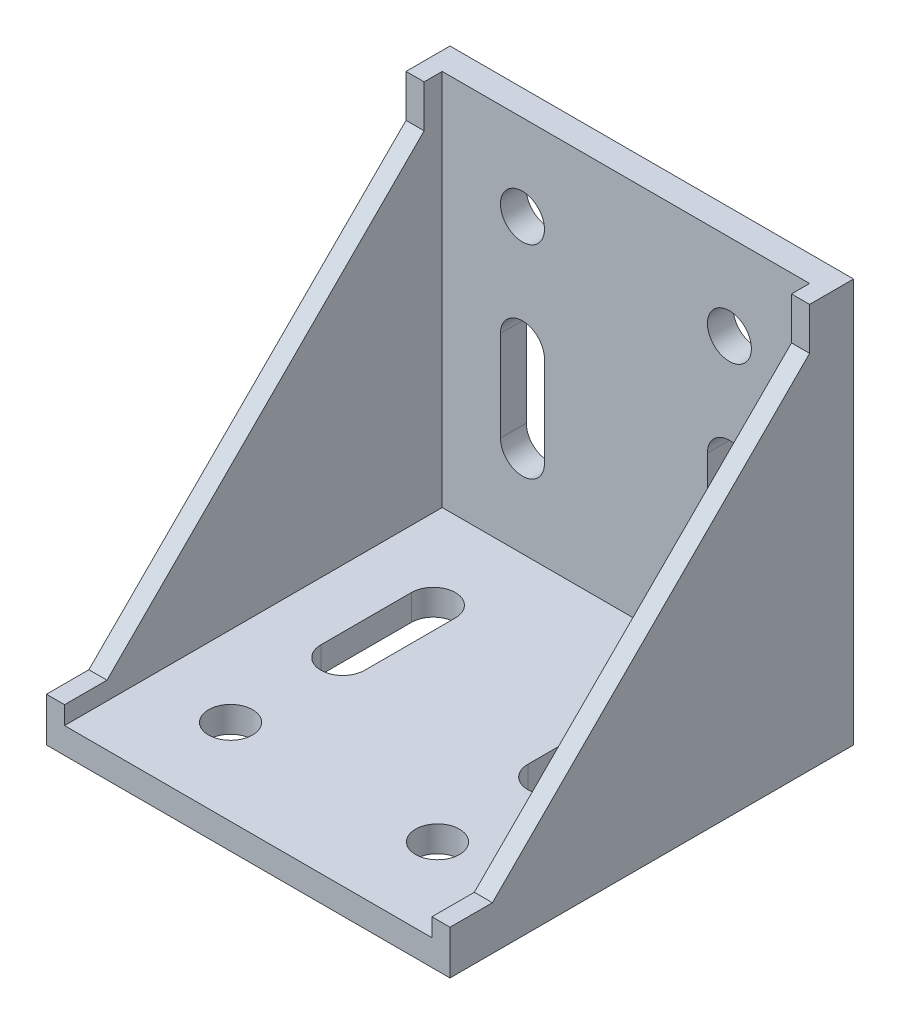
ISO-10303-21;
HEADER;
FILE_DESCRIPTION(('STEP AP214'),'2;1');
FILE_NAME('part.step','',(''),(''),'','','');
FILE_SCHEMA(('AUTOMOTIVE_DESIGN { 1 0 10303 214 1 1 1 1 }'));
ENDSEC;
DATA;
#1=APPLICATION_CONTEXT('core data for automotive mechanical design processes');
#2=APPLICATION_PROTOCOL_DEFINITION('international standard','automotive_design',2000,#1);
#3=PRODUCT_CONTEXT('',#1,'mechanical');
#4=PRODUCT('Part','Part','',(#3));
#5=PRODUCT_RELATED_PRODUCT_CATEGORY('part','',(#4));
#6=PRODUCT_DEFINITION_FORMATION('','',#4);
#7=PRODUCT_DEFINITION_CONTEXT('part definition',#1,'design');
#8=PRODUCT_DEFINITION('design','',#6,#7);
#9=PRODUCT_DEFINITION_SHAPE('','',#8);
#10=(LENGTH_UNIT() NAMED_UNIT(*) SI_UNIT(.MILLI.,.METRE.));
#11=(NAMED_UNIT(*) PLANE_ANGLE_UNIT() SI_UNIT($,.RADIAN.));
#12=(NAMED_UNIT(*) SI_UNIT($,.STERADIAN.) SOLID_ANGLE_UNIT());
#13=UNCERTAINTY_MEASURE_WITH_UNIT(LENGTH_MEASURE(1.E-05),#10,'distance_accuracy_value','');
#14=(GEOMETRIC_REPRESENTATION_CONTEXT(3) GLOBAL_UNCERTAINTY_ASSIGNED_CONTEXT((#13)) GLOBAL_UNIT_ASSIGNED_CONTEXT((#10,
#11,#12)) REPRESENTATION_CONTEXT('',''));
#15=CARTESIAN_POINT('',(0.,0.,0.));
#16=DIRECTION('',(0.,0.,1.));
#17=DIRECTION('',(1.,0.,0.));
#18=AXIS2_PLACEMENT_3D('',#15,#16,#17);
#19=CARTESIAN_POINT('',(-39.,0.,5.));
#20=DIRECTION('',(0.,0.,1.));
#21=DIRECTION('',(1.,0.,0.));
#22=AXIS2_PLACEMENT_3D('',#19,#20,#21);
#23=PLANE('',#22);
#24=DIRECTION('',(-1.,0.,0.));
#25=VECTOR('',#24,1.);
#26=CARTESIAN_POINT('',(-39.,4.99999999999999,5.));
#27=LINE('',#26,#25);
#28=CARTESIAN_POINT('',(35.5,5.,5.));
#29=VERTEX_POINT('',#28);
#30=CARTESIAN_POINT('',(-35.5,4.99999999999999,5.));
#31=VERTEX_POINT('',#30);
#32=EDGE_CURVE('E314',#29,#31,#27,.T.);
#33=ORIENTED_EDGE('',*,*,#32,.F.);
#34=DIRECTION('',(0.,-1.,0.));
#35=VECTOR('',#34,1.);
#36=CARTESIAN_POINT('',(35.5,0.,5.));
#37=LINE('',#36,#35);
#38=CARTESIAN_POINT('',(35.5,78.,5.));
#39=VERTEX_POINT('',#38);
#40=EDGE_CURVE('E319',#39,#29,#37,.T.);
#41=ORIENTED_EDGE('',*,*,#40,.F.);
#42=DIRECTION('',(-1.,0.,0.));
#43=VECTOR('',#42,1.);
#44=CARTESIAN_POINT('',(-39.,78.,5.));
#45=LINE('',#44,#43);
#46=CARTESIAN_POINT('',(-35.5,78.,5.));
#47=VERTEX_POINT('',#46);
#48=EDGE_CURVE('E369',#39,#47,#45,.T.);
#49=ORIENTED_EDGE('',*,*,#48,.T.);
#50=DIRECTION('',(0.,-1.,0.));
#51=VECTOR('',#50,1.);
#52=CARTESIAN_POINT('',(-35.5,0.,5.));
#53=LINE('',#52,#51);
#54=EDGE_CURVE('E358',#47,#31,#53,.T.);
#55=ORIENTED_EDGE('',*,*,#54,.T.);
#56=EDGE_LOOP('',(#33,#41,#49,#55));
#57=FACE_BOUND('',#56,.T.);
#58=CARTESIAN_POINT('',(20.,61.45,5.));
#59=DIRECTION('',(0.,0.,1.));
#60=DIRECTION('',(-1.,0.,0.));
#61=AXIS2_PLACEMENT_3D('',#58,#59,#60);
#62=CIRCLE('',#61,4.25);
#63=CARTESIAN_POINT('',(15.75,61.45,5.));
#64=VERTEX_POINT('',#63);
#65=EDGE_CURVE('E441',#64,#64,#62,.T.);
#66=ORIENTED_EDGE('',*,*,#65,.F.);
#67=EDGE_LOOP('',(#66));
#68=FACE_BOUND('',#67,.T.);
#69=CARTESIAN_POINT('',(-20.,61.45,5.));
#70=DIRECTION('',(0.,0.,1.));
#71=DIRECTION('',(1.,0.,0.));
#72=AXIS2_PLACEMENT_3D('',#69,#70,#71);
#73=CIRCLE('',#72,4.25);
#74=CARTESIAN_POINT('',(-15.75,61.45,5.));
#75=VERTEX_POINT('',#74);
#76=EDGE_CURVE('E480',#75,#75,#73,.T.);
#77=ORIENTED_EDGE('',*,*,#76,.F.);
#78=EDGE_LOOP('',(#77));
#79=FACE_BOUND('',#78,.T.);
#80=DIRECTION('',(0.,-1.,0.));
#81=VECTOR('',#80,1.);
#82=CARTESIAN_POINT('',(-24.25,39.75,5.));
#83=LINE('',#82,#81);
#84=CARTESIAN_POINT('',(-24.25,39.75,5.));
#85=VERTEX_POINT('',#84);
#86=CARTESIAN_POINT('',(-24.25,22.25,5.));
#87=VERTEX_POINT('',#86);
#88=EDGE_CURVE('E488',#85,#87,#83,.T.);
#89=ORIENTED_EDGE('',*,*,#88,.F.);
#90=CARTESIAN_POINT('',(-20.,39.75,5.));
#91=DIRECTION('',(0.,0.,1.));
#92=DIRECTION('',(1.,0.,0.));
#93=AXIS2_PLACEMENT_3D('',#90,#91,#92);
#94=CIRCLE('',#93,4.25);
#95=CARTESIAN_POINT('',(-15.75,39.75,5.));
#96=VERTEX_POINT('',#95);
#97=EDGE_CURVE('E486',#96,#85,#94,.T.);
#98=ORIENTED_EDGE('',*,*,#97,.F.);
#99=DIRECTION('',(0.,1.,0.));
#100=VECTOR('',#99,1.);
#101=CARTESIAN_POINT('',(-15.75,39.75,5.));
#102=LINE('',#101,#100);
#103=CARTESIAN_POINT('',(-15.75,22.25,5.));
#104=VERTEX_POINT('',#103);
#105=EDGE_CURVE('E494',#104,#96,#102,.T.);
#106=ORIENTED_EDGE('',*,*,#105,.F.);
#107=CARTESIAN_POINT('',(-20.,22.25,5.));
#108=DIRECTION('',(0.,0.,1.));
#109=DIRECTION('',(1.,0.,0.));
#110=AXIS2_PLACEMENT_3D('',#107,#108,#109);
#111=CIRCLE('',#110,4.25);
#112=EDGE_CURVE('E491',#87,#104,#111,.T.);
#113=ORIENTED_EDGE('',*,*,#112,.F.);
#114=EDGE_LOOP('',(#89,#98,#106,#113));
#115=FACE_BOUND('',#114,.T.);
#116=DIRECTION('',(0.,-1.,0.));
#117=VECTOR('',#116,1.);
#118=CARTESIAN_POINT('',(15.75,39.75,5.));
#119=LINE('',#118,#117);
#120=CARTESIAN_POINT('',(15.75,39.75,5.));
#121=VERTEX_POINT('',#120);
#122=CARTESIAN_POINT('',(15.75,22.25,5.));
#123=VERTEX_POINT('',#122);
#124=EDGE_CURVE('E451',#121,#123,#119,.T.);
#125=ORIENTED_EDGE('',*,*,#124,.F.);
#126=CARTESIAN_POINT('',(20.,39.75,5.));
#127=DIRECTION('',(0.,0.,1.));
#128=DIRECTION('',(-1.,0.,0.));
#129=AXIS2_PLACEMENT_3D('',#126,#127,#128);
#130=CIRCLE('',#129,4.25);
#131=CARTESIAN_POINT('',(24.25,39.75,5.));
#132=VERTEX_POINT('',#131);
#133=EDGE_CURVE('E449',#132,#121,#130,.T.);
#134=ORIENTED_EDGE('',*,*,#133,.F.);
#135=DIRECTION('',(0.,1.,0.));
#136=VECTOR('',#135,1.);
#137=CARTESIAN_POINT('',(24.25,39.75,5.));
#138=LINE('',#137,#136);
#139=CARTESIAN_POINT('',(24.25,22.25,5.));
#140=VERTEX_POINT('',#139);
#141=EDGE_CURVE('E457',#140,#132,#138,.T.);
#142=ORIENTED_EDGE('',*,*,#141,.F.);
#143=CARTESIAN_POINT('',(20.,22.25,5.));
#144=DIRECTION('',(0.,0.,1.));
#145=DIRECTION('',(-1.,0.,0.));
#146=AXIS2_PLACEMENT_3D('',#143,#144,#145);
#147=CIRCLE('',#146,4.25);
#148=EDGE_CURVE('E454',#123,#140,#147,.T.);
#149=ORIENTED_EDGE('',*,*,#148,.F.);
#150=EDGE_LOOP('',(#125,#134,#142,#149));
#151=FACE_BOUND('',#150,.T.);
#152=ADVANCED_FACE('F30',(#57,#68,#79,#115,#151),#23,.T.);
#153=CARTESIAN_POINT('',(-39.,0.,0.));
#154=DIRECTION('',(0.,0.,1.));
#155=DIRECTION('',(1.,0.,0.));
#156=AXIS2_PLACEMENT_3D('',#153,#154,#155);
#157=PLANE('',#156);
#158=CARTESIAN_POINT('',(20.,39.75,0.));
#159=DIRECTION('',(0.,0.,1.));
#160=DIRECTION('',(-1.,0.,0.));
#161=AXIS2_PLACEMENT_3D('',#158,#159,#160);
#162=CIRCLE('',#161,4.25);
#163=CARTESIAN_POINT('',(24.25,39.75,0.));
#164=VERTEX_POINT('',#163);
#165=CARTESIAN_POINT('',(15.75,39.75,0.));
#166=VERTEX_POINT('',#165);
#167=EDGE_CURVE('E444',#164,#166,#162,.T.);
#168=ORIENTED_EDGE('',*,*,#167,.T.);
#169=DIRECTION('',(0.,-1.,0.));
#170=VECTOR('',#169,1.);
#171=CARTESIAN_POINT('',(15.75,39.75,0.));
#172=LINE('',#171,#170);
#173=CARTESIAN_POINT('',(15.75,22.25,0.));
#174=VERTEX_POINT('',#173);
#175=EDGE_CURVE('E462',#166,#174,#172,.T.);
#176=ORIENTED_EDGE('',*,*,#175,.T.);
#177=CARTESIAN_POINT('',(20.,22.25,0.));
#178=DIRECTION('',(0.,0.,1.));
#179=DIRECTION('',(-1.,0.,0.));
#180=AXIS2_PLACEMENT_3D('',#177,#178,#179);
#181=CIRCLE('',#180,4.25);
#182=CARTESIAN_POINT('',(24.25,22.25,0.));
#183=VERTEX_POINT('',#182);
#184=EDGE_CURVE('E465',#174,#183,#181,.T.);
#185=ORIENTED_EDGE('',*,*,#184,.T.);
#186=DIRECTION('',(0.,1.,0.));
#187=VECTOR('',#186,1.);
#188=CARTESIAN_POINT('',(24.25,39.75,0.));
#189=LINE('',#188,#187);
#190=EDGE_CURVE('E452',#183,#164,#189,.T.);
#191=ORIENTED_EDGE('',*,*,#190,.T.);
#192=EDGE_LOOP('',(#168,#176,#185,#191));
#193=FACE_BOUND('',#192,.T.);
#194=CARTESIAN_POINT('',(-20.,39.75,0.));
#195=DIRECTION('',(0.,0.,1.));
#196=DIRECTION('',(1.,0.,0.));
#197=AXIS2_PLACEMENT_3D('',#194,#195,#196);
#198=CIRCLE('',#197,4.25);
#199=CARTESIAN_POINT('',(-15.75,39.75,0.));
#200=VERTEX_POINT('',#199);
#201=CARTESIAN_POINT('',(-24.25,39.75,0.));
#202=VERTEX_POINT('',#201);
#203=EDGE_CURVE('E483',#200,#202,#198,.T.);
#204=ORIENTED_EDGE('',*,*,#203,.T.);
#205=DIRECTION('',(0.,-1.,0.));
#206=VECTOR('',#205,1.);
#207=CARTESIAN_POINT('',(-24.25,39.75,0.));
#208=LINE('',#207,#206);
#209=CARTESIAN_POINT('',(-24.25,22.25,0.));
#210=VERTEX_POINT('',#209);
#211=EDGE_CURVE('E499',#202,#210,#208,.T.);
#212=ORIENTED_EDGE('',*,*,#211,.T.);
#213=CARTESIAN_POINT('',(-20.,22.25,0.));
#214=DIRECTION('',(0.,0.,1.));
#215=DIRECTION('',(1.,0.,0.));
#216=AXIS2_PLACEMENT_3D('',#213,#214,#215);
#217=CIRCLE('',#216,4.25);
#218=CARTESIAN_POINT('',(-15.75,22.25,0.));
#219=VERTEX_POINT('',#218);
#220=EDGE_CURVE('E502',#210,#219,#217,.T.);
#221=ORIENTED_EDGE('',*,*,#220,.T.);
#222=DIRECTION('',(0.,1.,0.));
#223=VECTOR('',#222,1.);
#224=CARTESIAN_POINT('',(-15.75,39.75,0.));
#225=LINE('',#224,#223);
#226=EDGE_CURVE('E489',#219,#200,#225,.T.);
#227=ORIENTED_EDGE('',*,*,#226,.T.);
#228=EDGE_LOOP('',(#204,#212,#221,#227));
#229=FACE_BOUND('',#228,.T.);
#230=DIRECTION('',(-1.,0.,0.));
#231=VECTOR('',#230,1.);
#232=CARTESIAN_POINT('',(-39.,78.,0.));
#233=LINE('',#232,#231);
#234=CARTESIAN_POINT('',(39.,78.,0.));
#235=VERTEX_POINT('',#234);
#236=CARTESIAN_POINT('',(-39.,78.,0.));
#237=VERTEX_POINT('',#236);
#238=EDGE_CURVE('E372',#235,#237,#233,.T.);
#239=ORIENTED_EDGE('',*,*,#238,.F.);
#240=DIRECTION('',(0.,1.,0.));
#241=VECTOR('',#240,1.);
#242=CARTESIAN_POINT('',(39.,78.,0.));
#243=LINE('',#242,#241);
#244=CARTESIAN_POINT('',(39.,0.,0.));
#245=VERTEX_POINT('',#244);
#246=EDGE_CURVE('E382',#245,#235,#243,.T.);
#247=ORIENTED_EDGE('',*,*,#246,.F.);
#248=DIRECTION('',(1.,0.,0.));
#249=VECTOR('',#248,1.);
#250=CARTESIAN_POINT('',(-39.,0.,0.));
#251=LINE('',#250,#249);
#252=CARTESIAN_POINT('',(-39.,0.,0.));
#253=VERTEX_POINT('',#252);
#254=EDGE_CURVE('E380',#253,#245,#251,.T.);
#255=ORIENTED_EDGE('',*,*,#254,.F.);
#256=DIRECTION('',(0.,-1.,0.));
#257=VECTOR('',#256,1.);
#258=CARTESIAN_POINT('',(-39.,78.,0.));
#259=LINE('',#258,#257);
#260=EDGE_CURVE('E378',#237,#253,#259,.T.);
#261=ORIENTED_EDGE('',*,*,#260,.F.);
#262=EDGE_LOOP('',(#239,#247,#255,#261));
#263=FACE_BOUND('',#262,.T.);
#264=CARTESIAN_POINT('',(-20.,61.45,0.));
#265=DIRECTION('',(0.,0.,1.));
#266=DIRECTION('',(1.,0.,0.));
#267=AXIS2_PLACEMENT_3D('',#264,#265,#266);
#268=CIRCLE('',#267,4.25);
#269=CARTESIAN_POINT('',(-15.75,61.45,0.));
#270=VERTEX_POINT('',#269);
#271=EDGE_CURVE('E479',#270,#270,#268,.T.);
#272=ORIENTED_EDGE('',*,*,#271,.T.);
#273=EDGE_LOOP('',(#272));
#274=FACE_BOUND('',#273,.T.);
#275=CARTESIAN_POINT('',(20.,61.45,0.));
#276=DIRECTION('',(0.,0.,1.));
#277=DIRECTION('',(-1.,0.,0.));
#278=AXIS2_PLACEMENT_3D('',#275,#276,#277);
#279=CIRCLE('',#278,4.25);
#280=CARTESIAN_POINT('',(15.75,61.45,0.));
#281=VERTEX_POINT('',#280);
#282=EDGE_CURVE('E445',#281,#281,#279,.T.);
#283=ORIENTED_EDGE('',*,*,#282,.T.);
#284=EDGE_LOOP('',(#283));
#285=FACE_BOUND('',#284,.T.);
#286=ADVANCED_FACE('F409',(#193,#229,#263,#274,#285),#157,.F.);
#287=CARTESIAN_POINT('',(-39.,78.,5.));
#288=DIRECTION('',(1.,0.,0.));
#289=DIRECTION('',(0.,1.,0.));
#290=AXIS2_PLACEMENT_3D('',#287,#288,#289);
#291=PLANE('',#290);
#292=ORIENTED_EDGE('',*,*,#260,.T.);
#293=DIRECTION('',(0.,0.,-1.));
#294=VECTOR('',#293,1.);
#295=CARTESIAN_POINT('',(-39.,0.,5.));
#296=LINE('',#295,#294);
#297=CARTESIAN_POINT('',(-39.,0.,78.));
#298=VERTEX_POINT('',#297);
#299=EDGE_CURVE('E38',#298,#253,#296,.T.);
#300=ORIENTED_EDGE('',*,*,#299,.F.);
#301=DIRECTION('',(0.,1.,0.));
#302=VECTOR('',#301,1.);
#303=CARTESIAN_POINT('',(-39.,8.50000000000001,78.));
#304=LINE('',#303,#302);
#305=CARTESIAN_POINT('',(-39.,8.50000000000001,78.));
#306=VERTEX_POINT('',#305);
#307=EDGE_CURVE('E345',#298,#306,#304,.T.);
#308=ORIENTED_EDGE('',*,*,#307,.T.);
#309=DIRECTION('',(0.,0.,-1.));
#310=VECTOR('',#309,1.);
#311=CARTESIAN_POINT('',(-39.,8.50000000000001,69.8));
#312=LINE('',#311,#310);
#313=CARTESIAN_POINT('',(-39.,8.50000000000001,69.8));
#314=VERTEX_POINT('',#313);
#315=EDGE_CURVE('E916',#306,#314,#312,.T.);
#316=ORIENTED_EDGE('',*,*,#315,.T.);
#317=DIRECTION('',(0.,0.707106781186547,-0.707106781186548));
#318=VECTOR('',#317,1.);
#319=CARTESIAN_POINT('',(-39.,69.8,8.5));
#320=LINE('',#319,#318);
#321=CARTESIAN_POINT('',(-39.,69.8,8.5));
#322=VERTEX_POINT('',#321);
#323=EDGE_CURVE('E918',#314,#322,#320,.T.);
#324=ORIENTED_EDGE('',*,*,#323,.T.);
#325=DIRECTION('',(0.,1.,0.));
#326=VECTOR('',#325,1.);
#327=CARTESIAN_POINT('',(-39.,78.,8.5));
#328=LINE('',#327,#326);
#329=CARTESIAN_POINT('',(-39.,78.,8.5));
#330=VERTEX_POINT('',#329);
#331=EDGE_CURVE('E361',#322,#330,#328,.T.);
#332=ORIENTED_EDGE('',*,*,#331,.T.);
#333=DIRECTION('',(0.,0.,-1.));
#334=VECTOR('',#333,1.);
#335=CARTESIAN_POINT('',(-39.,78.,5.));
#336=LINE('',#335,#334);
#337=EDGE_CURVE('E371',#330,#237,#336,.T.);
#338=ORIENTED_EDGE('',*,*,#337,.T.);
#339=EDGE_LOOP('',(#292,#300,#308,#316,#324,#332,#338));
#340=FACE_BOUND('',#339,.T.);
#341=ADVANCED_FACE('F32',(#340),#291,.F.);
#342=CARTESIAN_POINT('',(-39.,0.,5.));
#343=DIRECTION('',(0.,1.,0.));
#344=DIRECTION('',(0.,0.,1.));
#345=AXIS2_PLACEMENT_3D('',#342,#343,#344);
#346=PLANE('',#345);
#347=DIRECTION('',(0.,0.,-1.));
#348=VECTOR('',#347,1.);
#349=CARTESIAN_POINT('',(39.,0.,5.));
#350=LINE('',#349,#348);
#351=CARTESIAN_POINT('',(39.,0.,78.));
#352=VERTEX_POINT('',#351);
#353=EDGE_CURVE('E389',#352,#245,#350,.T.);
#354=ORIENTED_EDGE('',*,*,#353,.F.);
#355=DIRECTION('',(-1.,0.,0.));
#356=VECTOR('',#355,1.);
#357=CARTESIAN_POINT('',(-35.5,0.,78.));
#358=LINE('',#357,#356);
#359=EDGE_CURVE('E366',#352,#298,#358,.T.);
#360=ORIENTED_EDGE('',*,*,#359,.T.);
#361=ORIENTED_EDGE('',*,*,#299,.T.);
#362=ORIENTED_EDGE('',*,*,#254,.T.);
#363=EDGE_LOOP('',(#354,#360,#361,#362));
#364=FACE_BOUND('',#363,.T.);
#365=CARTESIAN_POINT('',(20.,0.,61.4142160787197));
#366=DIRECTION('',(0.,-1.,0.));
#367=DIRECTION('',(-1.,0.,0.));
#368=AXIS2_PLACEMENT_3D('',#365,#366,#367);
#369=CIRCLE('',#368,4.25);
#370=CARTESIAN_POINT('',(15.75,0.,61.4142160787197));
#371=VERTEX_POINT('',#370);
#372=EDGE_CURVE('E257',#371,#371,#369,.T.);
#373=ORIENTED_EDGE('',*,*,#372,.F.);
#374=EDGE_LOOP('',(#373));
#375=FACE_BOUND('',#374,.T.);
#376=DIRECTION('',(0.,0.,-1.));
#377=VECTOR('',#376,1.);
#378=CARTESIAN_POINT('',(15.75,0.,39.7142160787197));
#379=LINE('',#378,#377);
#380=CARTESIAN_POINT('',(15.75,0.,39.7142160787197));
#381=VERTEX_POINT('',#380);
#382=CARTESIAN_POINT('',(15.75,0.,22.2142160787197));
#383=VERTEX_POINT('',#382);
#384=EDGE_CURVE('E263',#381,#383,#379,.T.);
#385=ORIENTED_EDGE('',*,*,#384,.F.);
#386=CARTESIAN_POINT('',(20.,0.,39.7142160787197));
#387=DIRECTION('',(0.,-1.,0.));
#388=DIRECTION('',(-1.,0.,0.));
#389=AXIS2_PLACEMENT_3D('',#386,#387,#388);
#390=CIRCLE('',#389,4.25);
#391=CARTESIAN_POINT('',(24.25,0.,39.7142160787197));
#392=VERTEX_POINT('',#391);
#393=EDGE_CURVE('E233',#392,#381,#390,.T.);
#394=ORIENTED_EDGE('',*,*,#393,.F.);
#395=DIRECTION('',(0.,0.,1.));
#396=VECTOR('',#395,1.);
#397=CARTESIAN_POINT('',(24.25,0.,39.7142160787197));
#398=LINE('',#397,#396);
#399=CARTESIAN_POINT('',(24.25,0.,22.2142160787197));
#400=VERTEX_POINT('',#399);
#401=EDGE_CURVE('E251',#400,#392,#398,.T.);
#402=ORIENTED_EDGE('',*,*,#401,.F.);
#403=CARTESIAN_POINT('',(20.,0.,22.2142160787197));
#404=DIRECTION('',(0.,-1.,0.));
#405=DIRECTION('',(-1.,0.,0.));
#406=AXIS2_PLACEMENT_3D('',#403,#404,#405);
#407=CIRCLE('',#406,4.25);
#408=EDGE_CURVE('E254',#383,#400,#407,.T.);
#409=ORIENTED_EDGE('',*,*,#408,.F.);
#410=EDGE_LOOP('',(#385,#394,#402,#409));
#411=FACE_BOUND('',#410,.T.);
#412=CARTESIAN_POINT('',(-20.,0.,61.4142160787197));
#413=DIRECTION('',(0.,-1.,0.));
#414=DIRECTION('',(1.,0.,0.));
#415=AXIS2_PLACEMENT_3D('',#412,#413,#414);
#416=CIRCLE('',#415,4.25);
#417=CARTESIAN_POINT('',(-15.75,0.,61.4142160787197));
#418=VERTEX_POINT('',#417);
#419=EDGE_CURVE('E270',#418,#418,#416,.T.);
#420=ORIENTED_EDGE('',*,*,#419,.F.);
#421=EDGE_LOOP('',(#420));
#422=FACE_BOUND('',#421,.T.);
#423=DIRECTION('',(0.,0.,-1.));
#424=VECTOR('',#423,1.);
#425=CARTESIAN_POINT('',(-24.25,0.,39.7142160787197));
#426=LINE('',#425,#424);
#427=CARTESIAN_POINT('',(-24.25,0.,39.7142160787197));
#428=VERTEX_POINT('',#427);
#429=CARTESIAN_POINT('',(-24.25,0.,22.2142160787197));
#430=VERTEX_POINT('',#429);
#431=EDGE_CURVE('E295',#428,#430,#426,.T.);
#432=ORIENTED_EDGE('',*,*,#431,.F.);
#433=CARTESIAN_POINT('',(-20.,0.,39.7142160787197));
#434=DIRECTION('',(0.,-1.,0.));
#435=DIRECTION('',(1.,0.,0.));
#436=AXIS2_PLACEMENT_3D('',#433,#434,#435);
#437=CIRCLE('',#436,4.25);
#438=CARTESIAN_POINT('',(-15.75,0.,39.7142160787197));
#439=VERTEX_POINT('',#438);
#440=EDGE_CURVE('E277',#439,#428,#437,.T.);
#441=ORIENTED_EDGE('',*,*,#440,.F.);
#442=DIRECTION('',(0.,0.,1.));
#443=VECTOR('',#442,1.);
#444=CARTESIAN_POINT('',(-15.75,0.,39.7142160787197));
#445=LINE('',#444,#443);
#446=CARTESIAN_POINT('',(-15.75,0.,22.2142160787197));
#447=VERTEX_POINT('',#446);
#448=EDGE_CURVE('E284',#447,#439,#445,.T.);
#449=ORIENTED_EDGE('',*,*,#448,.F.);
#450=CARTESIAN_POINT('',(-20.,0.,22.2142160787197));
#451=DIRECTION('',(0.,-1.,0.));
#452=DIRECTION('',(1.,0.,0.));
#453=AXIS2_PLACEMENT_3D('',#450,#451,#452);
#454=CIRCLE('',#453,4.25);
#455=EDGE_CURVE('E298',#430,#447,#454,.T.);
#456=ORIENTED_EDGE('',*,*,#455,.F.);
#457=EDGE_LOOP('',(#432,#441,#449,#456));
#458=FACE_BOUND('',#457,.T.);
#459=ADVANCED_FACE('F398',(#364,#375,#411,#422,#458),#346,.F.);
#460=CARTESIAN_POINT('',(39.,78.,5.));
#461=DIRECTION('',(-1.,0.,0.));
#462=DIRECTION('',(0.,-1.,0.));
#463=AXIS2_PLACEMENT_3D('',#460,#461,#462);
#464=PLANE('',#463);
#465=DIRECTION('',(0.,0.,-1.));
#466=VECTOR('',#465,1.);
#467=CARTESIAN_POINT('',(39.,8.50000000000001,69.8));
#468=LINE('',#467,#466);
#469=CARTESIAN_POINT('',(39.,8.50000000000001,78.));
#470=VERTEX_POINT('',#469);
#471=CARTESIAN_POINT('',(39.,8.50000000000001,69.8));
#472=VERTEX_POINT('',#471);
#473=EDGE_CURVE('E339',#470,#472,#468,.T.);
#474=ORIENTED_EDGE('',*,*,#473,.F.);
#475=DIRECTION('',(0.,1.,0.));
#476=VECTOR('',#475,1.);
#477=CARTESIAN_POINT('',(39.,8.50000000000001,78.));
#478=LINE('',#477,#476);
#479=EDGE_CURVE('E323',#352,#470,#478,.T.);
#480=ORIENTED_EDGE('',*,*,#479,.F.);
#481=ORIENTED_EDGE('',*,*,#353,.T.);
#482=ORIENTED_EDGE('',*,*,#246,.T.);
#483=DIRECTION('',(0.,0.,-1.));
#484=VECTOR('',#483,1.);
#485=CARTESIAN_POINT('',(39.,78.,5.));
#486=LINE('',#485,#484);
#487=CARTESIAN_POINT('',(39.,78.,8.5));
#488=VERTEX_POINT('',#487);
#489=EDGE_CURVE('E387',#488,#235,#486,.T.);
#490=ORIENTED_EDGE('',*,*,#489,.F.);
#491=DIRECTION('',(0.,1.,0.));
#492=VECTOR('',#491,1.);
#493=CARTESIAN_POINT('',(39.,78.,8.5));
#494=LINE('',#493,#492);
#495=CARTESIAN_POINT('',(39.,69.8,8.5));
#496=VERTEX_POINT('',#495);
#497=EDGE_CURVE('E318',#496,#488,#494,.T.);
#498=ORIENTED_EDGE('',*,*,#497,.F.);
#499=DIRECTION('',(0.,0.707106781186547,-0.707106781186548));
#500=VECTOR('',#499,1.);
#501=CARTESIAN_POINT('',(39.,69.8,8.5));
#502=LINE('',#501,#500);
#503=EDGE_CURVE('E337',#472,#496,#502,.T.);
#504=ORIENTED_EDGE('',*,*,#503,.F.);
#505=EDGE_LOOP('',(#474,#480,#481,#482,#490,#498,#504));
#506=FACE_BOUND('',#505,.T.);
#507=ADVANCED_FACE('F412',(#506),#464,.F.);
#508=CARTESIAN_POINT('',(-39.,78.,5.));
#509=DIRECTION('',(0.,-1.,0.));
#510=DIRECTION('',(1.,0.,0.));
#511=AXIS2_PLACEMENT_3D('',#508,#509,#510);
#512=PLANE('',#511);
#513=ORIENTED_EDGE('',*,*,#238,.T.);
#514=ORIENTED_EDGE('',*,*,#337,.F.);
#515=DIRECTION('',(-1.,0.,0.));
#516=VECTOR('',#515,1.);
#517=CARTESIAN_POINT('',(-35.5,78.,8.5));
#518=LINE('',#517,#516);
#519=CARTESIAN_POINT('',(-35.5,78.,8.5));
#520=VERTEX_POINT('',#519);
#521=EDGE_CURVE('E448',#520,#330,#518,.T.);
#522=ORIENTED_EDGE('',*,*,#521,.F.);
#523=DIRECTION('',(0.,0.,-1.));
#524=VECTOR('',#523,1.);
#525=CARTESIAN_POINT('',(-35.5,78.,5.));
#526=LINE('',#525,#524);
#527=EDGE_CURVE('E363',#520,#47,#526,.T.);
#528=ORIENTED_EDGE('',*,*,#527,.T.);
#529=ORIENTED_EDGE('',*,*,#48,.F.);
#530=DIRECTION('',(0.,0.,-1.));
#531=VECTOR('',#530,1.);
#532=CARTESIAN_POINT('',(35.5,78.,5.));
#533=LINE('',#532,#531);
#534=CARTESIAN_POINT('',(35.5,78.,8.5));
#535=VERTEX_POINT('',#534);
#536=EDGE_CURVE('E322',#535,#39,#533,.T.);
#537=ORIENTED_EDGE('',*,*,#536,.F.);
#538=DIRECTION('',(1.,0.,0.));
#539=VECTOR('',#538,1.);
#540=CARTESIAN_POINT('',(35.5,78.,8.5));
#541=LINE('',#540,#539);
#542=EDGE_CURVE('E334',#535,#488,#541,.T.);
#543=ORIENTED_EDGE('',*,*,#542,.T.);
#544=ORIENTED_EDGE('',*,*,#489,.T.);
#545=EDGE_LOOP('',(#513,#514,#522,#528,#529,#537,#543,#544));
#546=FACE_BOUND('',#545,.T.);
#547=ADVANCED_FACE('F415',(#546),#512,.F.);
#548=CARTESIAN_POINT('',(-20.,39.75,5.));
#549=DIRECTION('',(0.,0.,-1.));
#550=DIRECTION('',(-1.,0.,0.));
#551=AXIS2_PLACEMENT_3D('',#548,#549,#550);
#552=CYLINDRICAL_SURFACE('',#551,4.25);
#553=ORIENTED_EDGE('',*,*,#203,.F.);
#554=DIRECTION('',(0.,0.,-1.));
#555=VECTOR('',#554,1.);
#556=CARTESIAN_POINT('',(-15.75,39.75,5.));
#557=LINE('',#556,#555);
#558=EDGE_CURVE('E496',#96,#200,#557,.T.);
#559=ORIENTED_EDGE('',*,*,#558,.F.);
#560=ORIENTED_EDGE('',*,*,#97,.T.);
#561=DIRECTION('',(0.,0.,-1.));
#562=VECTOR('',#561,1.);
#563=CARTESIAN_POINT('',(-24.25,39.75,5.));
#564=LINE('',#563,#562);
#565=EDGE_CURVE('E376',#85,#202,#564,.T.);
#566=ORIENTED_EDGE('',*,*,#565,.T.);
#567=EDGE_LOOP('',(#553,#559,#560,#566));
#568=FACE_BOUND('',#567,.T.);
#569=ADVANCED_FACE('F517',(#568),#552,.F.);
#570=CARTESIAN_POINT('',(-24.25,39.75,5.));
#571=DIRECTION('',(1.,0.,0.));
#572=DIRECTION('',(0.,1.,0.));
#573=AXIS2_PLACEMENT_3D('',#570,#571,#572);
#574=PLANE('',#573);
#575=ORIENTED_EDGE('',*,*,#211,.F.);
#576=ORIENTED_EDGE('',*,*,#565,.F.);
#577=ORIENTED_EDGE('',*,*,#88,.T.);
#578=DIRECTION('',(0.,0.,-1.));
#579=VECTOR('',#578,1.);
#580=CARTESIAN_POINT('',(-24.25,22.25,5.));
#581=LINE('',#580,#579);
#582=EDGE_CURVE('E510',#87,#210,#581,.T.);
#583=ORIENTED_EDGE('',*,*,#582,.T.);
#584=EDGE_LOOP('',(#575,#576,#577,#583));
#585=FACE_BOUND('',#584,.T.);
#586=ADVANCED_FACE('F529',(#585),#574,.T.);
#587=CARTESIAN_POINT('',(-20.,22.25,5.));
#588=DIRECTION('',(0.,0.,-1.));
#589=DIRECTION('',(-1.,0.,0.));
#590=AXIS2_PLACEMENT_3D('',#587,#588,#589);
#591=CYLINDRICAL_SURFACE('',#590,4.25);
#592=ORIENTED_EDGE('',*,*,#220,.F.);
#593=ORIENTED_EDGE('',*,*,#582,.F.);
#594=ORIENTED_EDGE('',*,*,#112,.T.);
#595=DIRECTION('',(0.,0.,-1.));
#596=VECTOR('',#595,1.);
#597=CARTESIAN_POINT('',(-15.75,22.25,5.));
#598=LINE('',#597,#596);
#599=EDGE_CURVE('E509',#104,#219,#598,.T.);
#600=ORIENTED_EDGE('',*,*,#599,.T.);
#601=EDGE_LOOP('',(#592,#593,#594,#600));
#602=FACE_BOUND('',#601,.T.);
#603=ADVANCED_FACE('F531',(#602),#591,.F.);
#604=CARTESIAN_POINT('',(-15.75,39.75,5.));
#605=DIRECTION('',(-1.,0.,0.));
#606=DIRECTION('',(0.,-1.,0.));
#607=AXIS2_PLACEMENT_3D('',#604,#605,#606);
#608=PLANE('',#607);
#609=ORIENTED_EDGE('',*,*,#226,.F.);
#610=ORIENTED_EDGE('',*,*,#599,.F.);
#611=ORIENTED_EDGE('',*,*,#105,.T.);
#612=ORIENTED_EDGE('',*,*,#558,.T.);
#613=EDGE_LOOP('',(#609,#610,#611,#612));
#614=FACE_BOUND('',#613,.T.);
#615=ADVANCED_FACE('F524',(#614),#608,.T.);
#616=CARTESIAN_POINT('',(-20.,61.45,5.));
#617=DIRECTION('',(0.,0.,-1.));
#618=DIRECTION('',(-1.,0.,0.));
#619=AXIS2_PLACEMENT_3D('',#616,#617,#618);
#620=CYLINDRICAL_SURFACE('',#619,4.25);
#621=ORIENTED_EDGE('',*,*,#76,.T.);
#622=EDGE_LOOP('',(#621));
#623=FACE_BOUND('',#622,.T.);
#624=ORIENTED_EDGE('',*,*,#271,.F.);
#625=EDGE_LOOP('',(#624));
#626=FACE_BOUND('',#625,.T.);
#627=ADVANCED_FACE('F538',(#623,#626),#620,.F.);
#628=CARTESIAN_POINT('',(20.,39.75,5.));
#629=DIRECTION('',(0.,0.,-1.));
#630=DIRECTION('',(-1.,0.,0.));
#631=AXIS2_PLACEMENT_3D('',#628,#629,#630);
#632=CYLINDRICAL_SURFACE('',#631,4.25);
#633=ORIENTED_EDGE('',*,*,#167,.F.);
#634=DIRECTION('',(0.,0.,-1.));
#635=VECTOR('',#634,1.);
#636=CARTESIAN_POINT('',(24.25,39.75,5.));
#637=LINE('',#636,#635);
#638=EDGE_CURVE('E459',#132,#164,#637,.T.);
#639=ORIENTED_EDGE('',*,*,#638,.F.);
#640=ORIENTED_EDGE('',*,*,#133,.T.);
#641=DIRECTION('',(0.,0.,-1.));
#642=VECTOR('',#641,1.);
#643=CARTESIAN_POINT('',(15.75,39.75,5.));
#644=LINE('',#643,#642);
#645=EDGE_CURVE('E476',#121,#166,#644,.T.);
#646=ORIENTED_EDGE('',*,*,#645,.T.);
#647=EDGE_LOOP('',(#633,#639,#640,#646));
#648=FACE_BOUND('',#647,.T.);
#649=ADVANCED_FACE('F680',(#648),#632,.F.);
#650=CARTESIAN_POINT('',(15.75,39.75,5.));
#651=DIRECTION('',(1.,0.,0.));
#652=DIRECTION('',(0.,1.,0.));
#653=AXIS2_PLACEMENT_3D('',#650,#651,#652);
#654=PLANE('',#653);
#655=ORIENTED_EDGE('',*,*,#175,.F.);
#656=ORIENTED_EDGE('',*,*,#645,.F.);
#657=ORIENTED_EDGE('',*,*,#124,.T.);
#658=DIRECTION('',(0.,0.,-1.));
#659=VECTOR('',#658,1.);
#660=CARTESIAN_POINT('',(15.75,22.25,5.));
#661=LINE('',#660,#659);
#662=EDGE_CURVE('E474',#123,#174,#661,.T.);
#663=ORIENTED_EDGE('',*,*,#662,.T.);
#664=EDGE_LOOP('',(#655,#656,#657,#663));
#665=FACE_BOUND('',#664,.T.);
#666=ADVANCED_FACE('F670',(#665),#654,.T.);
#667=CARTESIAN_POINT('',(20.,22.25,5.));
#668=DIRECTION('',(0.,0.,-1.));
#669=DIRECTION('',(-1.,0.,0.));
#670=AXIS2_PLACEMENT_3D('',#667,#668,#669);
#671=CYLINDRICAL_SURFACE('',#670,4.25);
#672=ORIENTED_EDGE('',*,*,#184,.F.);
#673=ORIENTED_EDGE('',*,*,#662,.F.);
#674=ORIENTED_EDGE('',*,*,#148,.T.);
#675=DIRECTION('',(0.,0.,-1.));
#676=VECTOR('',#675,1.);
#677=CARTESIAN_POINT('',(24.25,22.25,5.));
#678=LINE('',#677,#676);
#679=EDGE_CURVE('E472',#140,#183,#678,.T.);
#680=ORIENTED_EDGE('',*,*,#679,.T.);
#681=EDGE_LOOP('',(#672,#673,#674,#680));
#682=FACE_BOUND('',#681,.T.);
#683=ADVANCED_FACE('F660',(#682),#671,.F.);
#684=CARTESIAN_POINT('',(24.25,39.75,5.));
#685=DIRECTION('',(-1.,0.,0.));
#686=DIRECTION('',(0.,0.,1.));
#687=AXIS2_PLACEMENT_3D('',#684,#685,#686);
#688=PLANE('',#687);
#689=ORIENTED_EDGE('',*,*,#190,.F.);
#690=ORIENTED_EDGE('',*,*,#679,.F.);
#691=ORIENTED_EDGE('',*,*,#141,.T.);
#692=ORIENTED_EDGE('',*,*,#638,.T.);
#693=EDGE_LOOP('',(#689,#690,#691,#692));
#694=FACE_BOUND('',#693,.T.);
#695=ADVANCED_FACE('F650',(#694),#688,.T.);
#696=CARTESIAN_POINT('',(20.,61.45,5.));
#697=DIRECTION('',(0.,0.,-1.));
#698=DIRECTION('',(-1.,0.,0.));
#699=AXIS2_PLACEMENT_3D('',#696,#697,#698);
#700=CYLINDRICAL_SURFACE('',#699,4.25);
#701=ORIENTED_EDGE('',*,*,#65,.T.);
#702=EDGE_LOOP('',(#701));
#703=FACE_BOUND('',#702,.T.);
#704=ORIENTED_EDGE('',*,*,#282,.F.);
#705=EDGE_LOOP('',(#704));
#706=FACE_BOUND('',#705,.T.);
#707=ADVANCED_FACE('F641',(#703,#706),#700,.F.);
#708=CARTESIAN_POINT('',(-35.5,78.,8.5));
#709=DIRECTION('',(0.,0.,1.));
#710=DIRECTION('',(0.,-1.,0.));
#711=AXIS2_PLACEMENT_3D('',#708,#709,#710);
#712=PLANE('',#711);
#713=ORIENTED_EDGE('',*,*,#331,.F.);
#714=DIRECTION('',(-1.,0.,0.));
#715=VECTOR('',#714,1.);
#716=CARTESIAN_POINT('',(-35.5,69.8,8.5));
#717=LINE('',#716,#715);
#718=CARTESIAN_POINT('',(-35.5,69.8,8.5));
#719=VERTEX_POINT('',#718);
#720=EDGE_CURVE('E906',#719,#322,#717,.T.);
#721=ORIENTED_EDGE('',*,*,#720,.F.);
#722=DIRECTION('',(0.,1.,0.));
#723=VECTOR('',#722,1.);
#724=CARTESIAN_POINT('',(-35.5,78.,8.5));
#725=LINE('',#724,#723);
#726=EDGE_CURVE('E367',#719,#520,#725,.T.);
#727=ORIENTED_EDGE('',*,*,#726,.T.);
#728=ORIENTED_EDGE('',*,*,#521,.T.);
#729=EDGE_LOOP('',(#713,#721,#727,#728));
#730=FACE_BOUND('',#729,.T.);
#731=ADVANCED_FACE('F631',(#730),#712,.T.);
#732=CARTESIAN_POINT('',(-35.5,69.8,8.5));
#733=DIRECTION('',(0.,0.707106781186548,0.707106781186547));
#734=DIRECTION('',(0.,-0.707106781186547,0.707106781186548));
#735=AXIS2_PLACEMENT_3D('',#732,#733,#734);
#736=PLANE('',#735);
#737=ORIENTED_EDGE('',*,*,#323,.F.);
#738=DIRECTION('',(-1.,0.,0.));
#739=VECTOR('',#738,1.);
#740=CARTESIAN_POINT('',(-35.5,8.50000000000001,69.8));
#741=LINE('',#740,#739);
#742=CARTESIAN_POINT('',(-35.5,8.50000000000001,69.8));
#743=VERTEX_POINT('',#742);
#744=EDGE_CURVE('E437',#743,#314,#741,.T.);
#745=ORIENTED_EDGE('',*,*,#744,.F.);
#746=DIRECTION('',(0.,0.707106781186547,-0.707106781186548));
#747=VECTOR('',#746,1.);
#748=CARTESIAN_POINT('',(-35.5,69.8,8.5));
#749=LINE('',#748,#747);
#750=EDGE_CURVE('E910',#743,#719,#749,.T.);
#751=ORIENTED_EDGE('',*,*,#750,.T.);
#752=ORIENTED_EDGE('',*,*,#720,.T.);
#753=EDGE_LOOP('',(#737,#745,#751,#752));
#754=FACE_BOUND('',#753,.T.);
#755=ADVANCED_FACE('F619',(#754),#736,.T.);
#756=CARTESIAN_POINT('',(-35.5,8.50000000000001,69.8));
#757=DIRECTION('',(0.,1.,0.));
#758=DIRECTION('',(0.,0.,1.));
#759=AXIS2_PLACEMENT_3D('',#756,#757,#758);
#760=PLANE('',#759);
#761=ORIENTED_EDGE('',*,*,#315,.F.);
#762=DIRECTION('',(-1.,0.,0.));
#763=VECTOR('',#762,1.);
#764=CARTESIAN_POINT('',(-35.5,8.50000000000001,78.));
#765=LINE('',#764,#763);
#766=CARTESIAN_POINT('',(-35.5,8.50000000000001,78.));
#767=VERTEX_POINT('',#766);
#768=EDGE_CURVE('E435',#767,#306,#765,.T.);
#769=ORIENTED_EDGE('',*,*,#768,.F.);
#770=DIRECTION('',(0.,0.,-1.));
#771=VECTOR('',#770,1.);
#772=CARTESIAN_POINT('',(-35.5,8.50000000000001,69.8));
#773=LINE('',#772,#771);
#774=EDGE_CURVE('E912',#767,#743,#773,.T.);
#775=ORIENTED_EDGE('',*,*,#774,.T.);
#776=ORIENTED_EDGE('',*,*,#744,.T.);
#777=EDGE_LOOP('',(#761,#769,#775,#776));
#778=FACE_BOUND('',#777,.T.);
#779=ADVANCED_FACE('F614',(#778),#760,.T.);
#780=CARTESIAN_POINT('',(-35.5,8.50000000000001,78.));
#781=DIRECTION('',(0.,0.,1.));
#782=DIRECTION('',(1.,0.,0.));
#783=AXIS2_PLACEMENT_3D('',#780,#781,#782);
#784=PLANE('',#783);
#785=ORIENTED_EDGE('',*,*,#768,.T.);
#786=ORIENTED_EDGE('',*,*,#307,.F.);
#787=ORIENTED_EDGE('',*,*,#359,.F.);
#788=ORIENTED_EDGE('',*,*,#479,.T.);
#789=DIRECTION('',(1.,0.,0.));
#790=VECTOR('',#789,1.);
#791=CARTESIAN_POINT('',(35.5,8.50000000000001,78.));
#792=LINE('',#791,#790);
#793=CARTESIAN_POINT('',(35.5,8.50000000000001,78.));
#794=VERTEX_POINT('',#793);
#795=EDGE_CURVE('E342',#794,#470,#792,.T.);
#796=ORIENTED_EDGE('',*,*,#795,.F.);
#797=DIRECTION('',(0.,1.,0.));
#798=VECTOR('',#797,1.);
#799=CARTESIAN_POINT('',(35.5,8.50000000000001,78.));
#800=LINE('',#799,#798);
#801=CARTESIAN_POINT('',(35.5,5.,78.));
#802=VERTEX_POINT('',#801);
#803=EDGE_CURVE('E332',#802,#794,#800,.T.);
#804=ORIENTED_EDGE('',*,*,#803,.F.);
#805=DIRECTION('',(-1.,0.,0.));
#806=VECTOR('',#805,1.);
#807=CARTESIAN_POINT('',(-39.,4.99999999999999,78.));
#808=LINE('',#807,#806);
#809=CARTESIAN_POINT('',(-35.5,4.99999999999999,78.));
#810=VERTEX_POINT('',#809);
#811=EDGE_CURVE('E305',#802,#810,#808,.T.);
#812=ORIENTED_EDGE('',*,*,#811,.T.);
#813=DIRECTION('',(0.,1.,0.));
#814=VECTOR('',#813,1.);
#815=CARTESIAN_POINT('',(-35.5,8.50000000000001,78.));
#816=LINE('',#815,#814);
#817=EDGE_CURVE('E45',#810,#767,#816,.T.);
#818=ORIENTED_EDGE('',*,*,#817,.T.);
#819=EDGE_LOOP('',(#785,#786,#787,#788,#796,#804,#812,#818));
#820=FACE_BOUND('',#819,.T.);
#821=ADVANCED_FACE('F433',(#820),#784,.T.);
#822=CARTESIAN_POINT('',(-35.5,78.,5.));
#823=DIRECTION('',(1.,0.,0.));
#824=DIRECTION('',(0.,1.,0.));
#825=AXIS2_PLACEMENT_3D('',#822,#823,#824);
#826=PLANE('',#825);
#827=DIRECTION('',(0.,0.,1.));
#828=VECTOR('',#827,1.);
#829=CARTESIAN_POINT('',(-35.5,4.99999999999999,5.));
#830=LINE('',#829,#828);
#831=EDGE_CURVE('E49',#31,#810,#830,.T.);
#832=ORIENTED_EDGE('',*,*,#831,.F.);
#833=ORIENTED_EDGE('',*,*,#54,.F.);
#834=ORIENTED_EDGE('',*,*,#527,.F.);
#835=ORIENTED_EDGE('',*,*,#726,.F.);
#836=ORIENTED_EDGE('',*,*,#750,.F.);
#837=ORIENTED_EDGE('',*,*,#774,.F.);
#838=ORIENTED_EDGE('',*,*,#817,.F.);
#839=EDGE_LOOP('',(#832,#833,#834,#835,#836,#837,#838));
#840=FACE_BOUND('',#839,.T.);
#841=ADVANCED_FACE('F599',(#840),#826,.T.);
#842=CARTESIAN_POINT('',(35.5,8.50000000000001,69.8));
#843=DIRECTION('',(0.,-1.,0.));
#844=DIRECTION('',(0.,0.,-1.));
#845=AXIS2_PLACEMENT_3D('',#842,#843,#844);
#846=PLANE('',#845);
#847=ORIENTED_EDGE('',*,*,#473,.T.);
#848=DIRECTION('',(1.,0.,0.));
#849=VECTOR('',#848,1.);
#850=CARTESIAN_POINT('',(35.5,8.50000000000001,69.8));
#851=LINE('',#850,#849);
#852=CARTESIAN_POINT('',(35.5,8.50000000000001,69.8));
#853=VERTEX_POINT('',#852);
#854=EDGE_CURVE('E346',#853,#472,#851,.T.);
#855=ORIENTED_EDGE('',*,*,#854,.F.);
#856=DIRECTION('',(0.,0.,-1.));
#857=VECTOR('',#856,1.);
#858=CARTESIAN_POINT('',(35.5,8.50000000000001,69.8));
#859=LINE('',#858,#857);
#860=EDGE_CURVE('E330',#794,#853,#859,.T.);
#861=ORIENTED_EDGE('',*,*,#860,.F.);
#862=ORIENTED_EDGE('',*,*,#795,.T.);
#863=EDGE_LOOP('',(#847,#855,#861,#862));
#864=FACE_BOUND('',#863,.T.);
#865=ADVANCED_FACE('F429',(#864),#846,.F.);
#866=CARTESIAN_POINT('',(35.5,69.8,8.5));
#867=DIRECTION('',(0.,-0.707106781186548,-0.707106781186547));
#868=DIRECTION('',(0.,0.707106781186547,-0.707106781186548));
#869=AXIS2_PLACEMENT_3D('',#866,#867,#868);
#870=PLANE('',#869);
#871=ORIENTED_EDGE('',*,*,#503,.T.);
#872=DIRECTION('',(1.,0.,0.));
#873=VECTOR('',#872,1.);
#874=CARTESIAN_POINT('',(35.5,69.8,8.5));
#875=LINE('',#874,#873);
#876=CARTESIAN_POINT('',(35.5,69.8,8.5));
#877=VERTEX_POINT('',#876);
#878=EDGE_CURVE('E349',#877,#496,#875,.T.);
#879=ORIENTED_EDGE('',*,*,#878,.F.);
#880=DIRECTION('',(0.,0.707106781186547,-0.707106781186548));
#881=VECTOR('',#880,1.);
#882=CARTESIAN_POINT('',(35.5,69.8,8.5));
#883=LINE('',#882,#881);
#884=EDGE_CURVE('E328',#853,#877,#883,.T.);
#885=ORIENTED_EDGE('',*,*,#884,.F.);
#886=ORIENTED_EDGE('',*,*,#854,.T.);
#887=EDGE_LOOP('',(#871,#879,#885,#886));
#888=FACE_BOUND('',#887,.T.);
#889=ADVANCED_FACE('F424',(#888),#870,.F.);
#890=CARTESIAN_POINT('',(35.5,78.,8.5));
#891=DIRECTION('',(0.,0.,-1.));
#892=DIRECTION('',(0.,1.,0.));
#893=AXIS2_PLACEMENT_3D('',#890,#891,#892);
#894=PLANE('',#893);
#895=ORIENTED_EDGE('',*,*,#497,.T.);
#896=ORIENTED_EDGE('',*,*,#542,.F.);
#897=DIRECTION('',(0.,1.,0.));
#898=VECTOR('',#897,1.);
#899=CARTESIAN_POINT('',(35.5,78.,8.5));
#900=LINE('',#899,#898);
#901=EDGE_CURVE('E326',#877,#535,#900,.T.);
#902=ORIENTED_EDGE('',*,*,#901,.F.);
#903=ORIENTED_EDGE('',*,*,#878,.T.);
#904=EDGE_LOOP('',(#895,#896,#902,#903));
#905=FACE_BOUND('',#904,.T.);
#906=ADVANCED_FACE('F420',(#905),#894,.F.);
#907=CARTESIAN_POINT('',(35.5,78.,5.));
#908=DIRECTION('',(-1.,0.,0.));
#909=DIRECTION('',(0.,1.,0.));
#910=AXIS2_PLACEMENT_3D('',#907,#908,#909);
#911=PLANE('',#910);
#912=DIRECTION('',(0.,0.,-1.));
#913=VECTOR('',#912,1.);
#914=CARTESIAN_POINT('',(35.5,5.,5.));
#915=LINE('',#914,#913);
#916=EDGE_CURVE('E11',#802,#29,#915,.T.);
#917=ORIENTED_EDGE('',*,*,#916,.F.);
#918=ORIENTED_EDGE('',*,*,#803,.T.);
#919=ORIENTED_EDGE('',*,*,#860,.T.);
#920=ORIENTED_EDGE('',*,*,#884,.T.);
#921=ORIENTED_EDGE('',*,*,#901,.T.);
#922=ORIENTED_EDGE('',*,*,#536,.T.);
#923=ORIENTED_EDGE('',*,*,#40,.T.);
#924=EDGE_LOOP('',(#917,#918,#919,#920,#921,#922,#923));
#925=FACE_BOUND('',#924,.T.);
#926=ADVANCED_FACE('F580',(#925),#911,.T.);
#927=CARTESIAN_POINT('',(-39.,4.99999999999999,78.));
#928=DIRECTION('',(0.,1.,0.));
#929=DIRECTION('',(-1.,0.,0.));
#930=AXIS2_PLACEMENT_3D('',#927,#928,#929);
#931=PLANE('',#930);
#932=CARTESIAN_POINT('',(20.,5.,61.4142160787197));
#933=DIRECTION('',(0.,-1.,0.));
#934=DIRECTION('',(-1.,0.,0.));
#935=AXIS2_PLACEMENT_3D('',#932,#933,#934);
#936=CIRCLE('',#935,4.25);
#937=CARTESIAN_POINT('',(15.75,5.,61.4142160787197));
#938=VERTEX_POINT('',#937);
#939=EDGE_CURVE('E264',#938,#938,#936,.T.);
#940=ORIENTED_EDGE('',*,*,#939,.T.);
#941=EDGE_LOOP('',(#940));
#942=FACE_BOUND('',#941,.T.);
#943=CARTESIAN_POINT('',(20.,5.,39.7142160787197));
#944=DIRECTION('',(0.,-1.,0.));
#945=DIRECTION('',(-1.,0.,0.));
#946=AXIS2_PLACEMENT_3D('',#943,#944,#945);
#947=CIRCLE('',#946,4.25);
#948=CARTESIAN_POINT('',(24.25,5.,39.7142160787197));
#949=VERTEX_POINT('',#948);
#950=CARTESIAN_POINT('',(15.75,5.,39.7142160787197));
#951=VERTEX_POINT('',#950);
#952=EDGE_CURVE('E230',#949,#951,#947,.T.);
#953=ORIENTED_EDGE('',*,*,#952,.T.);
#954=DIRECTION('',(0.,0.,-1.));
#955=VECTOR('',#954,1.);
#956=CARTESIAN_POINT('',(15.75,5.,39.7142160787197));
#957=LINE('',#956,#955);
#958=CARTESIAN_POINT('',(15.75,5.,22.2142160787197));
#959=VERTEX_POINT('',#958);
#960=EDGE_CURVE('E242',#951,#959,#957,.T.);
#961=ORIENTED_EDGE('',*,*,#960,.T.);
#962=CARTESIAN_POINT('',(20.,5.,22.2142160787197));
#963=DIRECTION('',(0.,-1.,0.));
#964=DIRECTION('',(-1.,0.,0.));
#965=AXIS2_PLACEMENT_3D('',#962,#963,#964);
#966=CIRCLE('',#965,4.25);
#967=CARTESIAN_POINT('',(24.25,5.,22.2142160787197));
#968=VERTEX_POINT('',#967);
#969=EDGE_CURVE('E246',#959,#968,#966,.T.);
#970=ORIENTED_EDGE('',*,*,#969,.T.);
#971=DIRECTION('',(0.,0.,1.));
#972=VECTOR('',#971,1.);
#973=CARTESIAN_POINT('',(24.25,5.,39.7142160787197));
#974=LINE('',#973,#972);
#975=EDGE_CURVE('E238',#968,#949,#974,.T.);
#976=ORIENTED_EDGE('',*,*,#975,.T.);
#977=EDGE_LOOP('',(#953,#961,#970,#976));
#978=FACE_BOUND('',#977,.T.);
#979=CARTESIAN_POINT('',(-20.,5.,61.4142160787197));
#980=DIRECTION('',(0.,-1.,0.));
#981=DIRECTION('',(1.,0.,0.));
#982=AXIS2_PLACEMENT_3D('',#979,#980,#981);
#983=CIRCLE('',#982,4.25);
#984=CARTESIAN_POINT('',(-15.75,5.,61.4142160787197));
#985=VERTEX_POINT('',#984);
#986=EDGE_CURVE('E274',#985,#985,#983,.T.);
#987=ORIENTED_EDGE('',*,*,#986,.T.);
#988=EDGE_LOOP('',(#987));
#989=FACE_BOUND('',#988,.T.);
#990=CARTESIAN_POINT('',(-20.,5.,39.7142160787197));
#991=DIRECTION('',(0.,-1.,0.));
#992=DIRECTION('',(1.,0.,0.));
#993=AXIS2_PLACEMENT_3D('',#990,#991,#992);
#994=CIRCLE('',#993,4.25);
#995=CARTESIAN_POINT('',(-15.75,5.,39.7142160787197));
#996=VERTEX_POINT('',#995);
#997=CARTESIAN_POINT('',(-24.25,5.,39.7142160787197));
#998=VERTEX_POINT('',#997);
#999=EDGE_CURVE('E280',#996,#998,#994,.T.);
#1000=ORIENTED_EDGE('',*,*,#999,.T.);
#1001=DIRECTION('',(0.,0.,-1.));
#1002=VECTOR('',#1001,1.);
#1003=CARTESIAN_POINT('',(-24.25,5.,39.7142160787197));
#1004=LINE('',#1003,#1002);
#1005=CARTESIAN_POINT('',(-24.25,5.,22.2142160787197));
#1006=VERTEX_POINT('',#1005);
#1007=EDGE_CURVE('E283',#998,#1006,#1004,.T.);
#1008=ORIENTED_EDGE('',*,*,#1007,.T.);
#1009=CARTESIAN_POINT('',(-20.,5.,22.2142160787197));
#1010=DIRECTION('',(0.,-1.,0.));
#1011=DIRECTION('',(1.,0.,0.));
#1012=AXIS2_PLACEMENT_3D('',#1009,#1010,#1011);
#1013=CIRCLE('',#1012,4.25);
#1014=CARTESIAN_POINT('',(-15.75,5.,22.2142160787197));
#1015=VERTEX_POINT('',#1014);
#1016=EDGE_CURVE('E287',#1006,#1015,#1013,.T.);
#1017=ORIENTED_EDGE('',*,*,#1016,.T.);
#1018=DIRECTION('',(0.,0.,1.));
#1019=VECTOR('',#1018,1.);
#1020=CARTESIAN_POINT('',(-15.75,5.,39.7142160787197));
#1021=LINE('',#1020,#1019);
#1022=EDGE_CURVE('E290',#1015,#996,#1021,.T.);
#1023=ORIENTED_EDGE('',*,*,#1022,.T.);
#1024=EDGE_LOOP('',(#1000,#1008,#1017,#1023));
#1025=FACE_BOUND('',#1024,.T.);
#1026=ORIENTED_EDGE('',*,*,#32,.T.);
#1027=ORIENTED_EDGE('',*,*,#831,.T.);
#1028=ORIENTED_EDGE('',*,*,#811,.F.);
#1029=ORIENTED_EDGE('',*,*,#916,.T.);
#1030=EDGE_LOOP('',(#1026,#1027,#1028,#1029));
#1031=FACE_BOUND('',#1030,.T.);
#1032=ADVANCED_FACE('F248',(#942,#978,#989,#1025,#1031),#931,.T.);
#1033=CARTESIAN_POINT('',(-20.,5.,39.7142160787197));
#1034=DIRECTION('',(0.,-1.,0.));
#1035=DIRECTION('',(1.,0.,0.));
#1036=AXIS2_PLACEMENT_3D('',#1033,#1034,#1035);
#1037=CYLINDRICAL_SURFACE('',#1036,4.25);
#1038=ORIENTED_EDGE('',*,*,#440,.T.);
#1039=DIRECTION('',(0.,-1.,0.));
#1040=VECTOR('',#1039,1.);
#1041=CARTESIAN_POINT('',(-24.25,5.,39.7142160787197));
#1042=LINE('',#1041,#1040);
#1043=EDGE_CURVE('E293',#998,#428,#1042,.T.);
#1044=ORIENTED_EDGE('',*,*,#1043,.F.);
#1045=ORIENTED_EDGE('',*,*,#999,.F.);
#1046=DIRECTION('',(0.,-1.,0.));
#1047=VECTOR('',#1046,1.);
#1048=CARTESIAN_POINT('',(-15.75,5.,39.7142160787197));
#1049=LINE('',#1048,#1047);
#1050=EDGE_CURVE('E303',#996,#439,#1049,.T.);
#1051=ORIENTED_EDGE('',*,*,#1050,.T.);
#1052=EDGE_LOOP('',(#1038,#1044,#1045,#1051));
#1053=FACE_BOUND('',#1052,.T.);
#1054=ADVANCED_FACE('F780',(#1053),#1037,.F.);
#1055=CARTESIAN_POINT('',(-15.75,5.,39.7142160787197));
#1056=DIRECTION('',(1.,0.,0.));
#1057=DIRECTION('',(0.,0.,-1.));
#1058=AXIS2_PLACEMENT_3D('',#1055,#1056,#1057);
#1059=PLANE('',#1058);
#1060=ORIENTED_EDGE('',*,*,#448,.T.);
#1061=ORIENTED_EDGE('',*,*,#1050,.F.);
#1062=ORIENTED_EDGE('',*,*,#1022,.F.);
#1063=DIRECTION('',(0.,-1.,0.));
#1064=VECTOR('',#1063,1.);
#1065=CARTESIAN_POINT('',(-15.75,5.,22.2142160787197));
#1066=LINE('',#1065,#1064);
#1067=EDGE_CURVE('E306',#1015,#447,#1066,.T.);
#1068=ORIENTED_EDGE('',*,*,#1067,.T.);
#1069=EDGE_LOOP('',(#1060,#1061,#1062,#1068));
#1070=FACE_BOUND('',#1069,.T.);
#1071=ADVANCED_FACE('F790',(#1070),#1059,.F.);
#1072=CARTESIAN_POINT('',(-20.,5.,22.2142160787197));
#1073=DIRECTION('',(0.,-1.,0.));
#1074=DIRECTION('',(1.,0.,0.));
#1075=AXIS2_PLACEMENT_3D('',#1072,#1073,#1074);
#1076=CYLINDRICAL_SURFACE('',#1075,4.25);
#1077=ORIENTED_EDGE('',*,*,#455,.T.);
#1078=ORIENTED_EDGE('',*,*,#1067,.F.);
#1079=ORIENTED_EDGE('',*,*,#1016,.F.);
#1080=DIRECTION('',(0.,-1.,0.));
#1081=VECTOR('',#1080,1.);
#1082=CARTESIAN_POINT('',(-24.25,5.,22.2142160787197));
#1083=LINE('',#1082,#1081);
#1084=EDGE_CURVE('E308',#1006,#430,#1083,.T.);
#1085=ORIENTED_EDGE('',*,*,#1084,.T.);
#1086=EDGE_LOOP('',(#1077,#1078,#1079,#1085));
#1087=FACE_BOUND('',#1086,.T.);
#1088=ADVANCED_FACE('F800',(#1087),#1076,.F.);
#1089=CARTESIAN_POINT('',(-24.25,5.,39.7142160787197));
#1090=DIRECTION('',(-1.,0.,0.));
#1091=DIRECTION('',(0.,0.,1.));
#1092=AXIS2_PLACEMENT_3D('',#1089,#1090,#1091);
#1093=PLANE('',#1092);
#1094=ORIENTED_EDGE('',*,*,#431,.T.);
#1095=ORIENTED_EDGE('',*,*,#1084,.F.);
#1096=ORIENTED_EDGE('',*,*,#1007,.F.);
#1097=ORIENTED_EDGE('',*,*,#1043,.T.);
#1098=EDGE_LOOP('',(#1094,#1095,#1096,#1097));
#1099=FACE_BOUND('',#1098,.T.);
#1100=ADVANCED_FACE('F810',(#1099),#1093,.F.);
#1101=CARTESIAN_POINT('',(-20.,5.,61.4142160787197));
#1102=DIRECTION('',(0.,-1.,0.));
#1103=DIRECTION('',(1.,0.,0.));
#1104=AXIS2_PLACEMENT_3D('',#1101,#1102,#1103);
#1105=CYLINDRICAL_SURFACE('',#1104,4.25);
#1106=ORIENTED_EDGE('',*,*,#986,.F.);
#1107=EDGE_LOOP('',(#1106));
#1108=FACE_BOUND('',#1107,.T.);
#1109=ORIENTED_EDGE('',*,*,#419,.T.);
#1110=EDGE_LOOP('',(#1109));
#1111=FACE_BOUND('',#1110,.T.);
#1112=ADVANCED_FACE('F820',(#1108,#1111),#1105,.F.);
#1113=CARTESIAN_POINT('',(20.,5.,39.7142160787197));
#1114=DIRECTION('',(0.,-1.,0.));
#1115=DIRECTION('',(1.,0.,0.));
#1116=AXIS2_PLACEMENT_3D('',#1113,#1114,#1115);
#1117=CYLINDRICAL_SURFACE('',#1116,4.25);
#1118=ORIENTED_EDGE('',*,*,#393,.T.);
#1119=DIRECTION('',(0.,-1.,0.));
#1120=VECTOR('',#1119,1.);
#1121=CARTESIAN_POINT('',(15.75,5.,39.7142160787197));
#1122=LINE('',#1121,#1120);
#1123=EDGE_CURVE('E226',#951,#381,#1122,.T.);
#1124=ORIENTED_EDGE('',*,*,#1123,.F.);
#1125=ORIENTED_EDGE('',*,*,#952,.F.);
#1126=DIRECTION('',(0.,-1.,0.));
#1127=VECTOR('',#1126,1.);
#1128=CARTESIAN_POINT('',(24.25,5.,39.7142160787197));
#1129=LINE('',#1128,#1127);
#1130=EDGE_CURVE('E268',#949,#392,#1129,.T.);
#1131=ORIENTED_EDGE('',*,*,#1130,.T.);
#1132=EDGE_LOOP('',(#1118,#1124,#1125,#1131));
#1133=FACE_BOUND('',#1132,.T.);
#1134=ADVANCED_FACE('F228',(#1133),#1117,.F.);
#1135=CARTESIAN_POINT('',(24.25,5.,39.7142160787197));
#1136=DIRECTION('',(1.,0.,0.));
#1137=DIRECTION('',(0.,1.,0.));
#1138=AXIS2_PLACEMENT_3D('',#1135,#1136,#1137);
#1139=PLANE('',#1138);
#1140=ORIENTED_EDGE('',*,*,#401,.T.);
#1141=ORIENTED_EDGE('',*,*,#1130,.F.);
#1142=ORIENTED_EDGE('',*,*,#975,.F.);
#1143=DIRECTION('',(0.,-1.,0.));
#1144=VECTOR('',#1143,1.);
#1145=CARTESIAN_POINT('',(24.25,5.,22.2142160787197));
#1146=LINE('',#1145,#1144);
#1147=EDGE_CURVE('E271',#968,#400,#1146,.T.);
#1148=ORIENTED_EDGE('',*,*,#1147,.T.);
#1149=EDGE_LOOP('',(#1140,#1141,#1142,#1148));
#1150=FACE_BOUND('',#1149,.T.);
#1151=ADVANCED_FACE('F839',(#1150),#1139,.F.);
#1152=CARTESIAN_POINT('',(20.,5.,22.2142160787197));
#1153=DIRECTION('',(0.,-1.,0.));
#1154=DIRECTION('',(1.,0.,0.));
#1155=AXIS2_PLACEMENT_3D('',#1152,#1153,#1154);
#1156=CYLINDRICAL_SURFACE('',#1155,4.25);
#1157=ORIENTED_EDGE('',*,*,#408,.T.);
#1158=ORIENTED_EDGE('',*,*,#1147,.F.);
#1159=ORIENTED_EDGE('',*,*,#969,.F.);
#1160=DIRECTION('',(0.,-1.,0.));
#1161=VECTOR('',#1160,1.);
#1162=CARTESIAN_POINT('',(15.75,5.,22.2142160787197));
#1163=LINE('',#1162,#1161);
#1164=EDGE_CURVE('E237',#959,#383,#1163,.T.);
#1165=ORIENTED_EDGE('',*,*,#1164,.T.);
#1166=EDGE_LOOP('',(#1157,#1158,#1159,#1165));
#1167=FACE_BOUND('',#1166,.T.);
#1168=ADVANCED_FACE('F848',(#1167),#1156,.F.);
#1169=CARTESIAN_POINT('',(15.75,5.,39.7142160787197));
#1170=DIRECTION('',(-1.,0.,0.));
#1171=DIRECTION('',(0.,0.,1.));
#1172=AXIS2_PLACEMENT_3D('',#1169,#1170,#1171);
#1173=PLANE('',#1172);
#1174=ORIENTED_EDGE('',*,*,#384,.T.);
#1175=ORIENTED_EDGE('',*,*,#1164,.F.);
#1176=ORIENTED_EDGE('',*,*,#960,.F.);
#1177=ORIENTED_EDGE('',*,*,#1123,.T.);
#1178=EDGE_LOOP('',(#1174,#1175,#1176,#1177));
#1179=FACE_BOUND('',#1178,.T.);
#1180=ADVANCED_FACE('F243',(#1179),#1173,.F.);
#1181=CARTESIAN_POINT('',(20.,5.,61.4142160787197));
#1182=DIRECTION('',(0.,-1.,0.));
#1183=DIRECTION('',(1.,0.,0.));
#1184=AXIS2_PLACEMENT_3D('',#1181,#1182,#1183);
#1185=CYLINDRICAL_SURFACE('',#1184,4.25);
#1186=ORIENTED_EDGE('',*,*,#939,.F.);
#1187=EDGE_LOOP('',(#1186));
#1188=FACE_BOUND('',#1187,.T.);
#1189=ORIENTED_EDGE('',*,*,#372,.T.);
#1190=EDGE_LOOP('',(#1189));
#1191=FACE_BOUND('',#1190,.T.);
#1192=ADVANCED_FACE('F867',(#1188,#1191),#1185,.F.);
#1193=CLOSED_SHELL('',(#152,#286,#341,#459,#507,#547,#569,#586,#603,#615,#627,#649,#666,#683,
#695,#707,#731,#755,#779,#821,#841,#865,#889,#906,#926,#1032,#1054,#1071,#1088,#1100,#1112,
#1134,#1151,#1168,#1180,#1192));
#1194=MANIFOLD_SOLID_BREP('B2',#1193);
#1195=ADVANCED_BREP_SHAPE_REPRESENTATION('',(#18,#1194),#14);
#1196=SHAPE_DEFINITION_REPRESENTATION(#9,#1195);
ENDSEC;
END-ISO-10303-21;
